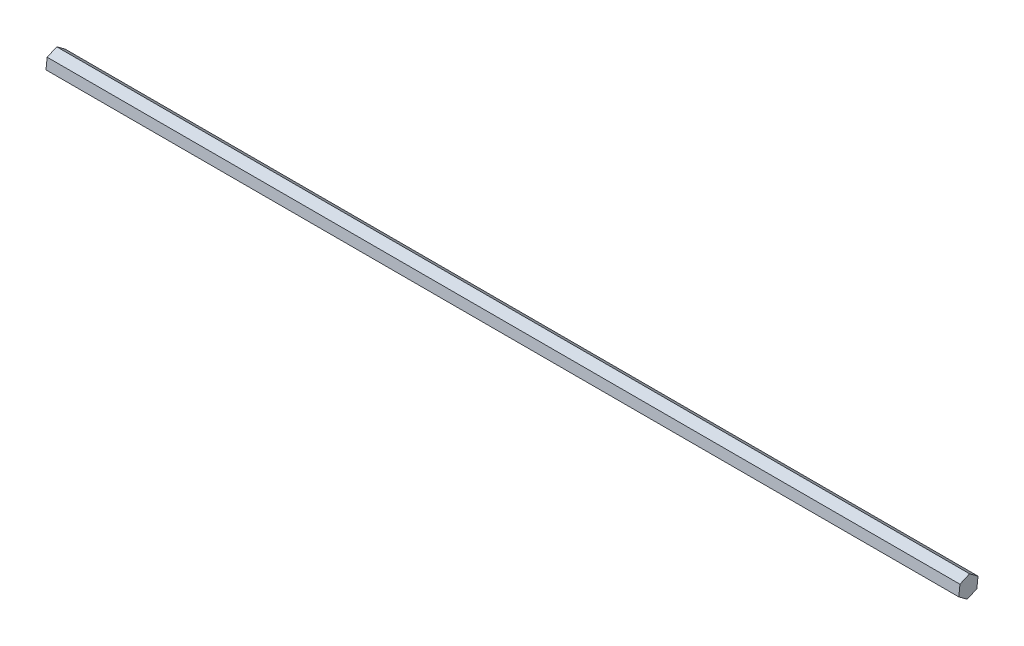
ISO-10303-21;
HEADER;
FILE_DESCRIPTION(('STEP AP214'),'2;1');
FILE_NAME('part.step','',(''),(''),'','','');
FILE_SCHEMA(('AUTOMOTIVE_DESIGN { 1 0 10303 214 1 1 1 1 }'));
ENDSEC;
DATA;
#1=APPLICATION_CONTEXT('core data for automotive mechanical design processes');
#2=APPLICATION_PROTOCOL_DEFINITION('international standard','automotive_design',2000,#1);
#3=PRODUCT_CONTEXT('',#1,'mechanical');
#4=PRODUCT('Part','Part','',(#3));
#5=PRODUCT_RELATED_PRODUCT_CATEGORY('part','',(#4));
#6=PRODUCT_DEFINITION_FORMATION('','',#4);
#7=PRODUCT_DEFINITION_CONTEXT('part definition',#1,'design');
#8=PRODUCT_DEFINITION('design','',#6,#7);
#9=PRODUCT_DEFINITION_SHAPE('','',#8);
#10=(LENGTH_UNIT() NAMED_UNIT(*) SI_UNIT(.MILLI.,.METRE.));
#11=(NAMED_UNIT(*) PLANE_ANGLE_UNIT() SI_UNIT($,.RADIAN.));
#12=(NAMED_UNIT(*) SI_UNIT($,.STERADIAN.) SOLID_ANGLE_UNIT());
#13=UNCERTAINTY_MEASURE_WITH_UNIT(LENGTH_MEASURE(1.E-05),#10,'distance_accuracy_value','');
#14=(GEOMETRIC_REPRESENTATION_CONTEXT(3) GLOBAL_UNCERTAINTY_ASSIGNED_CONTEXT((#13)) GLOBAL_UNIT_ASSIGNED_CONTEXT((#10,
#11,#12)) REPRESENTATION_CONTEXT('',''));
#15=CARTESIAN_POINT('',(0.,0.,0.));
#16=DIRECTION('',(0.,0.,1.));
#17=DIRECTION('',(1.,0.,0.));
#18=AXIS2_PLACEMENT_3D('',#15,#16,#17);
#19=CARTESIAN_POINT('',(50.,0.860694180813656,-0.0959454382110013));
#20=DIRECTION('',(0.,-0.9160883053923,-0.40097657877171));
#21=DIRECTION('',(0.,0.40097657877171,-0.9160883053923));
#22=AXIS2_PLACEMENT_3D('',#19,#20,#21);
#23=PLANE('',#22);
#24=DIRECTION('',(-1.,0.,0.));
#25=VECTOR('',#24,1.);
#26=CARTESIAN_POINT('',(50.,0.860694180813656,-0.0959454382110013));
#27=LINE('',#26,#25);
#28=CARTESIAN_POINT('',(50.,0.860694180813656,-0.0959454382110013));
#29=VERTEX_POINT('',#28);
#30=CARTESIAN_POINT('',(-25.4,0.860694180813655,-0.0959454382110086));
#31=VERTEX_POINT('',#30);
#32=EDGE_CURVE('E98',#29,#31,#27,.T.);
#33=ORIENTED_EDGE('',*,*,#32,.T.);
#34=DIRECTION('',(0.,0.400976578771702,-0.916088305392303));
#35=VECTOR('',#34,1.);
#36=CARTESIAN_POINT('',(-25.4,0.513438277274791,0.697410306368558));
#37=LINE('',#36,#35);
#38=CARTESIAN_POINT('',(-25.4,0.513438277274791,0.697410306368558));
#39=VERTEX_POINT('',#38);
#40=EDGE_CURVE('E114',#39,#31,#37,.T.);
#41=ORIENTED_EDGE('',*,*,#40,.F.);
#42=DIRECTION('',(-1.,0.,0.));
#43=VECTOR('',#42,1.);
#44=CARTESIAN_POINT('',(50.,0.513438277274785,0.697410306368562));
#45=LINE('',#44,#43);
#46=CARTESIAN_POINT('',(50.,0.513438277274785,0.697410306368562));
#47=VERTEX_POINT('',#46);
#48=EDGE_CURVE('E11',#47,#39,#45,.T.);
#49=ORIENTED_EDGE('',*,*,#48,.F.);
#50=DIRECTION('',(0.,-0.40097657877171,0.9160883053923));
#51=VECTOR('',#50,1.);
#52=CARTESIAN_POINT('',(50.,0.860694180813656,-0.0959454382110013));
#53=LINE('',#52,#51);
#54=EDGE_CURVE('E129',#29,#47,#53,.T.);
#55=ORIENTED_EDGE('',*,*,#54,.F.);
#56=EDGE_LOOP('',(#33,#41,#49,#55));
#57=FACE_BOUND('',#56,.T.);
#58=ADVANCED_FACE('F39',(#57),#23,.F.);
#59=CARTESIAN_POINT('',(50.,0.513438277274785,0.697410306368562));
#60=DIRECTION('',(0.,-0.110788249157277,-0.993844033965423));
#61=DIRECTION('',(0.,0.993844033965423,-0.110788249157277));
#62=AXIS2_PLACEMENT_3D('',#59,#60,#61);
#63=PLANE('',#62);
#64=ORIENTED_EDGE('',*,*,#48,.T.);
#65=DIRECTION('',(0.,0.993844033965422,-0.110788249157285));
#66=VECTOR('',#65,1.);
#67=CARTESIAN_POINT('',(-25.4,-0.347255903538864,0.793355744579566));
#68=LINE('',#67,#66);
#69=CARTESIAN_POINT('',(-25.4,-0.347255903538864,0.793355744579566));
#70=VERTEX_POINT('',#69);
#71=EDGE_CURVE('E124',#70,#39,#68,.T.);
#72=ORIENTED_EDGE('',*,*,#71,.F.);
#73=DIRECTION('',(-1.,0.,0.));
#74=VECTOR('',#73,1.);
#75=CARTESIAN_POINT('',(50.,-0.347255903538871,0.793355744579563));
#76=LINE('',#75,#74);
#77=CARTESIAN_POINT('',(50.,-0.347255903538871,0.793355744579563));
#78=VERTEX_POINT('',#77);
#79=EDGE_CURVE('E47',#78,#70,#76,.T.);
#80=ORIENTED_EDGE('',*,*,#79,.F.);
#81=DIRECTION('',(0.,-0.993844033965423,0.110788249157277));
#82=VECTOR('',#81,1.);
#83=CARTESIAN_POINT('',(50.,0.513438277274785,0.697410306368562));
#84=LINE('',#83,#82);
#85=EDGE_CURVE('E132',#47,#78,#84,.T.);
#86=ORIENTED_EDGE('',*,*,#85,.F.);
#87=EDGE_LOOP('',(#64,#72,#80,#86));
#88=FACE_BOUND('',#87,.T.);
#89=ADVANCED_FACE('F160',(#88),#63,.F.);
#90=CARTESIAN_POINT('',(50.,-0.347255903538871,0.793355744579563));
#91=DIRECTION('',(0.,0.805300056235022,-0.592867455193714));
#92=DIRECTION('',(0.,0.592867455193714,0.805300056235022));
#93=AXIS2_PLACEMENT_3D('',#90,#91,#92);
#94=PLANE('',#93);
#95=ORIENTED_EDGE('',*,*,#79,.T.);
#96=DIRECTION('',(0.,0.59286745519372,0.805300056235018));
#97=VECTOR('',#96,1.);
#98=CARTESIAN_POINT('',(-25.4,-0.860694180813655,0.0959454382110082));
#99=LINE('',#98,#97);
#100=CARTESIAN_POINT('',(-25.4,-0.860694180813655,0.0959454382110082));
#101=VERTEX_POINT('',#100);
#102=EDGE_CURVE('E120',#101,#70,#99,.T.);
#103=ORIENTED_EDGE('',*,*,#102,.F.);
#104=DIRECTION('',(-1.,0.,0.));
#105=VECTOR('',#104,1.);
#106=CARTESIAN_POINT('',(50.,-0.860694180813656,0.095945438211001));
#107=LINE('',#106,#105);
#108=CARTESIAN_POINT('',(50.,-0.860694180813656,0.095945438211001));
#109=VERTEX_POINT('',#108);
#110=EDGE_CURVE('E149',#109,#101,#107,.T.);
#111=ORIENTED_EDGE('',*,*,#110,.F.);
#112=DIRECTION('',(0.,-0.592867455193714,-0.805300056235022));
#113=VECTOR('',#112,1.);
#114=CARTESIAN_POINT('',(50.,-0.347255903538871,0.793355744579563));
#115=LINE('',#114,#113);
#116=EDGE_CURVE('E135',#78,#109,#115,.T.);
#117=ORIENTED_EDGE('',*,*,#116,.F.);
#118=EDGE_LOOP('',(#95,#103,#111,#117));
#119=FACE_BOUND('',#118,.T.);
#120=ADVANCED_FACE('F156',(#119),#94,.F.);
#121=CARTESIAN_POINT('',(50.,-0.860694180813656,0.095945438211001));
#122=DIRECTION('',(0.,0.9160883053923,0.40097657877171));
#123=DIRECTION('',(0.,-0.40097657877171,0.9160883053923));
#124=AXIS2_PLACEMENT_3D('',#121,#122,#123);
#125=PLANE('',#124);
#126=ORIENTED_EDGE('',*,*,#110,.T.);
#127=DIRECTION('',(0.,-0.400976578771702,0.916088305392303));
#128=VECTOR('',#127,1.);
#129=CARTESIAN_POINT('',(-25.4,-0.513438277274791,-0.697410306368558));
#130=LINE('',#129,#128);
#131=CARTESIAN_POINT('',(-25.4,-0.513438277274791,-0.697410306368558));
#132=VERTEX_POINT('',#131);
#133=EDGE_CURVE('E108',#132,#101,#130,.T.);
#134=ORIENTED_EDGE('',*,*,#133,.F.);
#135=DIRECTION('',(-1.,0.,0.));
#136=VECTOR('',#135,1.);
#137=CARTESIAN_POINT('',(50.,-0.513438277274786,-0.697410306368562));
#138=LINE('',#137,#136);
#139=CARTESIAN_POINT('',(50.,-0.513438277274786,-0.697410306368562));
#140=VERTEX_POINT('',#139);
#141=EDGE_CURVE('E97',#140,#132,#138,.T.);
#142=ORIENTED_EDGE('',*,*,#141,.F.);
#143=DIRECTION('',(0.,0.40097657877171,-0.916088305392299));
#144=VECTOR('',#143,1.);
#145=CARTESIAN_POINT('',(50.,-0.860694180813656,0.095945438211001));
#146=LINE('',#145,#144);
#147=EDGE_CURVE('E138',#109,#140,#146,.T.);
#148=ORIENTED_EDGE('',*,*,#147,.F.);
#149=EDGE_LOOP('',(#126,#134,#142,#148));
#150=FACE_BOUND('',#149,.T.);
#151=ADVANCED_FACE('F167',(#150),#125,.F.);
#152=CARTESIAN_POINT('',(50.,-0.513438277274786,-0.697410306368562));
#153=DIRECTION('',(0.,0.110788249157277,0.993844033965423));
#154=DIRECTION('',(0.,-0.993844033965423,0.110788249157277));
#155=AXIS2_PLACEMENT_3D('',#152,#153,#154);
#156=PLANE('',#155);
#157=ORIENTED_EDGE('',*,*,#141,.T.);
#158=DIRECTION('',(0.,-0.993844033965422,0.110788249157285));
#159=VECTOR('',#158,1.);
#160=CARTESIAN_POINT('',(-25.4,0.347255903538864,-0.793355744579566));
#161=LINE('',#160,#159);
#162=CARTESIAN_POINT('',(-25.4,0.347255903538864,-0.793355744579566));
#163=VERTEX_POINT('',#162);
#164=EDGE_CURVE('E101',#163,#132,#161,.T.);
#165=ORIENTED_EDGE('',*,*,#164,.F.);
#166=DIRECTION('',(-1.,0.,0.));
#167=VECTOR('',#166,1.);
#168=CARTESIAN_POINT('',(50.,0.34725590353887,-0.793355744579564));
#169=LINE('',#168,#167);
#170=CARTESIAN_POINT('',(50.,0.34725590353887,-0.793355744579564));
#171=VERTEX_POINT('',#170);
#172=EDGE_CURVE('E90',#171,#163,#169,.T.);
#173=ORIENTED_EDGE('',*,*,#172,.F.);
#174=DIRECTION('',(0.,0.993844033965423,-0.110788249157277));
#175=VECTOR('',#174,1.);
#176=CARTESIAN_POINT('',(50.,-0.513438277274786,-0.697410306368562));
#177=LINE('',#176,#175);
#178=EDGE_CURVE('E59',#140,#171,#177,.T.);
#179=ORIENTED_EDGE('',*,*,#178,.F.);
#180=EDGE_LOOP('',(#157,#165,#173,#179));
#181=FACE_BOUND('',#180,.T.);
#182=ADVANCED_FACE('F102',(#181),#156,.F.);
#183=CARTESIAN_POINT('',(50.,0.34725590353887,-0.793355744579564));
#184=DIRECTION('',(0.,-0.805300056235022,0.592867455193713));
#185=DIRECTION('',(0.,-0.592867455193713,-0.805300056235023));
#186=AXIS2_PLACEMENT_3D('',#183,#184,#185);
#187=PLANE('',#186);
#188=ORIENTED_EDGE('',*,*,#172,.T.);
#189=DIRECTION('',(0.,-0.59286745519372,-0.805300056235017));
#190=VECTOR('',#189,1.);
#191=CARTESIAN_POINT('',(-25.4,0.860694180813655,-0.0959454382110086));
#192=LINE('',#191,#190);
#193=EDGE_CURVE('E94',#31,#163,#192,.T.);
#194=ORIENTED_EDGE('',*,*,#193,.F.);
#195=ORIENTED_EDGE('',*,*,#32,.F.);
#196=DIRECTION('',(0.,0.592867455193713,0.805300056235023));
#197=VECTOR('',#196,1.);
#198=CARTESIAN_POINT('',(50.,0.34725590353887,-0.793355744579564));
#199=LINE('',#198,#197);
#200=EDGE_CURVE('E54',#171,#29,#199,.T.);
#201=ORIENTED_EDGE('',*,*,#200,.F.);
#202=EDGE_LOOP('',(#188,#194,#195,#201));
#203=FACE_BOUND('',#202,.T.);
#204=ADVANCED_FACE('F92',(#203),#187,.F.);
#205=CARTESIAN_POINT('',(50.,0.,0.));
#206=DIRECTION('',(1.,0.,0.));
#207=DIRECTION('',(0.,0.,-1.));
#208=AXIS2_PLACEMENT_3D('',#205,#206,#207);
#209=PLANE('',#208);
#210=ORIENTED_EDGE('',*,*,#54,.T.);
#211=ORIENTED_EDGE('',*,*,#85,.T.);
#212=ORIENTED_EDGE('',*,*,#116,.T.);
#213=ORIENTED_EDGE('',*,*,#147,.T.);
#214=ORIENTED_EDGE('',*,*,#178,.T.);
#215=ORIENTED_EDGE('',*,*,#200,.T.);
#216=EDGE_LOOP('',(#210,#211,#212,#213,#214,#215));
#217=FACE_BOUND('',#216,.T.);
#218=ADVANCED_FACE('F164',(#217),#209,.T.);
#219=CARTESIAN_POINT('',(-25.4,0.,0.));
#220=DIRECTION('',(-1.,0.,0.));
#221=DIRECTION('',(0.,0.,1.));
#222=AXIS2_PLACEMENT_3D('',#219,#220,#221);
#223=PLANE('',#222);
#224=ORIENTED_EDGE('',*,*,#193,.T.);
#225=ORIENTED_EDGE('',*,*,#164,.T.);
#226=ORIENTED_EDGE('',*,*,#133,.T.);
#227=ORIENTED_EDGE('',*,*,#102,.T.);
#228=ORIENTED_EDGE('',*,*,#71,.T.);
#229=ORIENTED_EDGE('',*,*,#40,.T.);
#230=EDGE_LOOP('',(#224,#225,#226,#227,#228,#229));
#231=FACE_BOUND('',#230,.T.);
#232=ADVANCED_FACE('F111',(#231),#223,.T.);
#233=CLOSED_SHELL('',(#58,#89,#120,#151,#182,#204,#218,#232));
#234=MANIFOLD_SOLID_BREP('B2',#233);
#235=ADVANCED_BREP_SHAPE_REPRESENTATION('',(#18,#234),#14);
#236=SHAPE_DEFINITION_REPRESENTATION(#9,#235);
ENDSEC;
END-ISO-10303-21;
